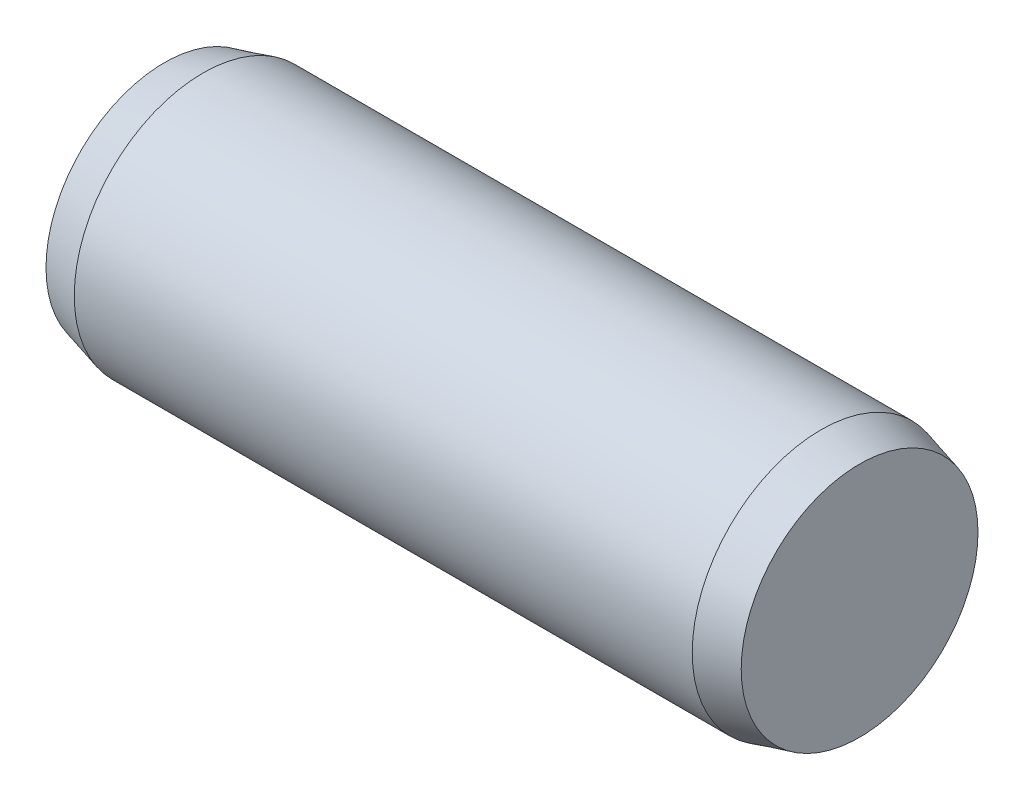
ISO-10303-21;
HEADER;
FILE_DESCRIPTION(('STEP AP214'),'2;1');
FILE_NAME('part.step','',(''),(''),'','','');
FILE_SCHEMA(('AUTOMOTIVE_DESIGN { 1 0 10303 214 1 1 1 1 }'));
ENDSEC;
DATA;
#1=APPLICATION_CONTEXT('core data for automotive mechanical design processes');
#2=APPLICATION_PROTOCOL_DEFINITION('international standard','automotive_design',2000,#1);
#3=PRODUCT_CONTEXT('',#1,'mechanical');
#4=PRODUCT('Part','Part','',(#3));
#5=PRODUCT_RELATED_PRODUCT_CATEGORY('part','',(#4));
#6=PRODUCT_DEFINITION_FORMATION('','',#4);
#7=PRODUCT_DEFINITION_CONTEXT('part definition',#1,'design');
#8=PRODUCT_DEFINITION('design','',#6,#7);
#9=PRODUCT_DEFINITION_SHAPE('','',#8);
#10=(LENGTH_UNIT() NAMED_UNIT(*) SI_UNIT(.MILLI.,.METRE.));
#11=(NAMED_UNIT(*) PLANE_ANGLE_UNIT() SI_UNIT($,.RADIAN.));
#12=(NAMED_UNIT(*) SI_UNIT($,.STERADIAN.) SOLID_ANGLE_UNIT());
#13=UNCERTAINTY_MEASURE_WITH_UNIT(LENGTH_MEASURE(1.E-05),#10,'distance_accuracy_value','');
#14=(GEOMETRIC_REPRESENTATION_CONTEXT(3) GLOBAL_UNCERTAINTY_ASSIGNED_CONTEXT((#13)) GLOBAL_UNIT_ASSIGNED_CONTEXT((#10,
#11,#12)) REPRESENTATION_CONTEXT('',''));
#15=CARTESIAN_POINT('',(0.,0.,0.));
#16=DIRECTION('',(0.,0.,1.));
#17=DIRECTION('',(1.,0.,0.));
#18=AXIS2_PLACEMENT_3D('',#15,#16,#17);
#19=CARTESIAN_POINT('',(-6.,0.,0.));
#20=DIRECTION('',(1.,0.,0.));
#21=DIRECTION('',(0.,0.,-1.));
#22=AXIS2_PLACEMENT_3D('',#19,#20,#21);
#23=CYLINDRICAL_SURFACE('',#22,2.5);
#24=CARTESIAN_POINT('',(-6.,0.,0.));
#25=DIRECTION('',(-1.,0.,0.));
#26=DIRECTION('',(0.,0.,1.));
#27=AXIS2_PLACEMENT_3D('',#24,#25,#26);
#28=CIRCLE('',#27,2.5);
#29=CARTESIAN_POINT('',(-6.,0.,2.5));
#30=VERTEX_POINT('',#29);
#31=EDGE_CURVE('E44',#30,#30,#28,.T.);
#32=ORIENTED_EDGE('',*,*,#31,.F.);
#33=EDGE_LOOP('',(#32));
#34=FACE_BOUND('',#33,.T.);
#35=CARTESIAN_POINT('',(6.,0.,0.));
#36=DIRECTION('',(1.,0.,0.));
#37=DIRECTION('',(0.,0.,-1.));
#38=AXIS2_PLACEMENT_3D('',#35,#36,#37);
#39=CIRCLE('',#38,2.5);
#40=CARTESIAN_POINT('',(6.,0.,-2.5));
#41=VERTEX_POINT('',#40);
#42=EDGE_CURVE('E10',#41,#41,#39,.T.);
#43=ORIENTED_EDGE('',*,*,#42,.F.);
#44=EDGE_LOOP('',(#43));
#45=FACE_BOUND('',#44,.T.);
#46=ADVANCED_FACE('F30',(#34,#45),#23,.T.);
#47=CARTESIAN_POINT('',(6.,0.,0.));
#48=DIRECTION('',(-1.,0.,0.));
#49=DIRECTION('',(0.,0.,-1.));
#50=AXIS2_PLACEMENT_3D('',#47,#48,#49);
#51=CONICAL_SURFACE('',#50,2.5,0.26179938779915);
#52=CARTESIAN_POINT('',(6.75,0.,0.));
#53=DIRECTION('',(1.,0.,0.));
#54=DIRECTION('',(0.,0.,-1.));
#55=AXIS2_PLACEMENT_3D('',#52,#53,#54);
#56=CIRCLE('',#55,2.29903810567666);
#57=CARTESIAN_POINT('',(6.75,0.,-2.29903810567666));
#58=VERTEX_POINT('',#57);
#59=EDGE_CURVE('E36',#58,#58,#56,.T.);
#60=ORIENTED_EDGE('',*,*,#59,.F.);
#61=EDGE_LOOP('',(#60));
#62=FACE_BOUND('',#61,.T.);
#63=ORIENTED_EDGE('',*,*,#42,.T.);
#64=EDGE_LOOP('',(#63));
#65=FACE_BOUND('',#64,.T.);
#66=ADVANCED_FACE('F54',(#62,#65),#51,.T.);
#67=CARTESIAN_POINT('',(6.75,0.,0.));
#68=DIRECTION('',(1.,0.,0.));
#69=DIRECTION('',(0.,0.,-1.));
#70=AXIS2_PLACEMENT_3D('',#67,#68,#69);
#71=PLANE('',#70);
#72=ORIENTED_EDGE('',*,*,#59,.T.);
#73=EDGE_LOOP('',(#72));
#74=FACE_BOUND('',#73,.T.);
#75=ADVANCED_FACE('F58',(#74),#71,.T.);
#76=CARTESIAN_POINT('',(-6.,0.,0.));
#77=DIRECTION('',(1.,0.,0.));
#78=DIRECTION('',(0.,0.,1.));
#79=AXIS2_PLACEMENT_3D('',#76,#77,#78);
#80=CONICAL_SURFACE('',#79,2.5,0.26179938779915);
#81=CARTESIAN_POINT('',(-6.75,0.,0.));
#82=DIRECTION('',(-1.,0.,0.));
#83=DIRECTION('',(0.,0.,1.));
#84=AXIS2_PLACEMENT_3D('',#81,#82,#83);
#85=CIRCLE('',#84,2.29903810567666);
#86=CARTESIAN_POINT('',(-6.75,0.,2.29903810567666));
#87=VERTEX_POINT('',#86);
#88=EDGE_CURVE('E40',#87,#87,#85,.T.);
#89=ORIENTED_EDGE('',*,*,#88,.F.);
#90=EDGE_LOOP('',(#89));
#91=FACE_BOUND('',#90,.T.);
#92=ORIENTED_EDGE('',*,*,#31,.T.);
#93=EDGE_LOOP('',(#92));
#94=FACE_BOUND('',#93,.T.);
#95=ADVANCED_FACE('F50',(#91,#94),#80,.T.);
#96=CARTESIAN_POINT('',(-6.75,0.,0.));
#97=DIRECTION('',(-1.,0.,0.));
#98=DIRECTION('',(0.,0.,1.));
#99=AXIS2_PLACEMENT_3D('',#96,#97,#98);
#100=PLANE('',#99);
#101=ORIENTED_EDGE('',*,*,#88,.T.);
#102=EDGE_LOOP('',(#101));
#103=FACE_BOUND('',#102,.T.);
#104=ADVANCED_FACE('F67',(#103),#100,.T.);
#105=CLOSED_SHELL('',(#46,#66,#75,#95,#104));
#106=MANIFOLD_SOLID_BREP('B2',#105);
#107=ADVANCED_BREP_SHAPE_REPRESENTATION('',(#18,#106),#14);
#108=SHAPE_DEFINITION_REPRESENTATION(#9,#107);
ENDSEC;
END-ISO-10303-21;
